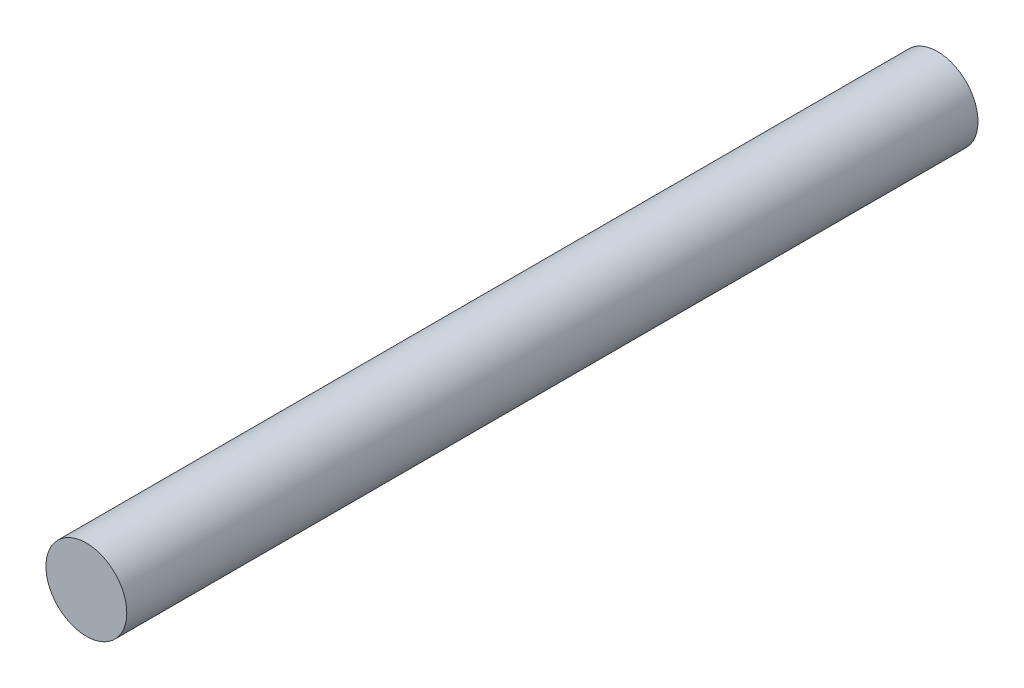
ISO-10303-21;
HEADER;
FILE_DESCRIPTION(('STEP AP214'),'2;1');
FILE_NAME('part.step','',(''),(''),'','','');
FILE_SCHEMA(('AUTOMOTIVE_DESIGN { 1 0 10303 214 1 1 1 1 }'));
ENDSEC;
DATA;
#1=APPLICATION_CONTEXT('core data for automotive mechanical design processes');
#2=APPLICATION_PROTOCOL_DEFINITION('international standard','automotive_design',2000,#1);
#3=PRODUCT_CONTEXT('',#1,'mechanical');
#4=PRODUCT('Part','Part','',(#3));
#5=PRODUCT_RELATED_PRODUCT_CATEGORY('part','',(#4));
#6=PRODUCT_DEFINITION_FORMATION('','',#4);
#7=PRODUCT_DEFINITION_CONTEXT('part definition',#1,'design');
#8=PRODUCT_DEFINITION('design','',#6,#7);
#9=PRODUCT_DEFINITION_SHAPE('','',#8);
#10=(LENGTH_UNIT() NAMED_UNIT(*) SI_UNIT(.MILLI.,.METRE.));
#11=(NAMED_UNIT(*) PLANE_ANGLE_UNIT() SI_UNIT($,.RADIAN.));
#12=(NAMED_UNIT(*) SI_UNIT($,.STERADIAN.) SOLID_ANGLE_UNIT());
#13=UNCERTAINTY_MEASURE_WITH_UNIT(LENGTH_MEASURE(1.E-05),#10,'distance_accuracy_value','');
#14=(GEOMETRIC_REPRESENTATION_CONTEXT(3) GLOBAL_UNCERTAINTY_ASSIGNED_CONTEXT((#13)) GLOBAL_UNIT_ASSIGNED_CONTEXT((#10,
#11,#12)) REPRESENTATION_CONTEXT('',''));
#15=CARTESIAN_POINT('',(0.,0.,0.));
#16=DIRECTION('',(0.,0.,1.));
#17=DIRECTION('',(1.,0.,0.));
#18=AXIS2_PLACEMENT_3D('',#15,#16,#17);
#19=CARTESIAN_POINT('',(0.,0.,101.6));
#20=DIRECTION('',(0.,0.,-1.));
#21=DIRECTION('',(-1.,0.,0.));
#22=AXIS2_PLACEMENT_3D('',#19,#20,#21);
#23=CYLINDRICAL_SURFACE('',#22,4.826);
#24=CARTESIAN_POINT('',(0.,0.,101.6));
#25=DIRECTION('',(0.,0.,1.));
#26=DIRECTION('',(1.,0.,0.));
#27=AXIS2_PLACEMENT_3D('',#24,#25,#26);
#28=CIRCLE('',#27,4.826);
#29=CARTESIAN_POINT('',(4.826,0.,101.6));
#30=VERTEX_POINT('',#29);
#31=EDGE_CURVE('E10',#30,#30,#28,.T.);
#32=ORIENTED_EDGE('',*,*,#31,.F.);
#33=EDGE_LOOP('',(#32));
#34=FACE_BOUND('',#33,.T.);
#35=CARTESIAN_POINT('',(0.,0.,0.));
#36=DIRECTION('',(0.,0.,1.));
#37=DIRECTION('',(1.,0.,0.));
#38=AXIS2_PLACEMENT_3D('',#35,#36,#37);
#39=CIRCLE('',#38,4.826);
#40=CARTESIAN_POINT('',(4.826,0.,0.));
#41=VERTEX_POINT('',#40);
#42=EDGE_CURVE('E40',#41,#41,#39,.T.);
#43=ORIENTED_EDGE('',*,*,#42,.T.);
#44=EDGE_LOOP('',(#43));
#45=FACE_BOUND('',#44,.T.);
#46=ADVANCED_FACE('F37',(#34,#45),#23,.T.);
#47=CARTESIAN_POINT('',(0.,0.,101.6));
#48=DIRECTION('',(0.,0.,1.));
#49=DIRECTION('',(1.,0.,0.));
#50=AXIS2_PLACEMENT_3D('',#47,#48,#49);
#51=PLANE('',#50);
#52=ORIENTED_EDGE('',*,*,#31,.T.);
#53=EDGE_LOOP('',(#52));
#54=FACE_BOUND('',#53,.T.);
#55=ADVANCED_FACE('F54',(#54),#51,.T.);
#56=CARTESIAN_POINT('',(0.,0.,0.));
#57=DIRECTION('',(0.,0.,1.));
#58=DIRECTION('',(1.,0.,0.));
#59=AXIS2_PLACEMENT_3D('',#56,#57,#58);
#60=PLANE('',#59);
#61=ORIENTED_EDGE('',*,*,#42,.F.);
#62=EDGE_LOOP('',(#61));
#63=FACE_BOUND('',#62,.T.);
#64=ADVANCED_FACE('F52',(#63),#60,.F.);
#65=CLOSED_SHELL('',(#46,#55,#64));
#66=MANIFOLD_SOLID_BREP('B2',#65);
#67=ADVANCED_BREP_SHAPE_REPRESENTATION('',(#18,#66),#14);
#68=SHAPE_DEFINITION_REPRESENTATION(#9,#67);
ENDSEC;
END-ISO-10303-21;
